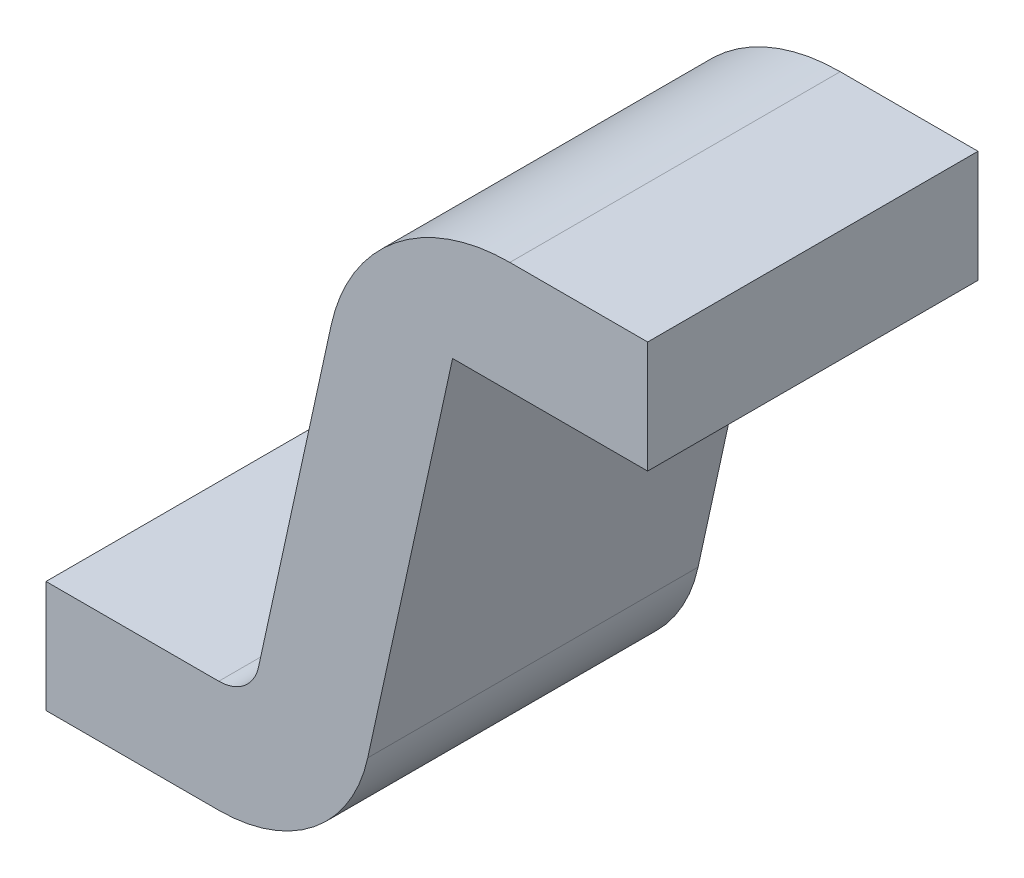
ISO-10303-21;
HEADER;
FILE_DESCRIPTION(('STEP AP214'),'2;1');
FILE_NAME('part.step','',(''),(''),'','','');
FILE_SCHEMA(('AUTOMOTIVE_DESIGN { 1 0 10303 214 1 1 1 1 }'));
ENDSEC;
DATA;
#1=APPLICATION_CONTEXT('core data for automotive mechanical design processes');
#2=APPLICATION_PROTOCOL_DEFINITION('international standard','automotive_design',2000,#1);
#3=PRODUCT_CONTEXT('',#1,'mechanical');
#4=PRODUCT('Part','Part','',(#3));
#5=PRODUCT_RELATED_PRODUCT_CATEGORY('part','',(#4));
#6=PRODUCT_DEFINITION_FORMATION('','',#4);
#7=PRODUCT_DEFINITION_CONTEXT('part definition',#1,'design');
#8=PRODUCT_DEFINITION('design','',#6,#7);
#9=PRODUCT_DEFINITION_SHAPE('','',#8);
#10=(LENGTH_UNIT() NAMED_UNIT(*) SI_UNIT(.MILLI.,.METRE.));
#11=(NAMED_UNIT(*) PLANE_ANGLE_UNIT() SI_UNIT($,.RADIAN.));
#12=(NAMED_UNIT(*) SI_UNIT($,.STERADIAN.) SOLID_ANGLE_UNIT());
#13=UNCERTAINTY_MEASURE_WITH_UNIT(LENGTH_MEASURE(1.E-05),#10,'distance_accuracy_value','');
#14=(GEOMETRIC_REPRESENTATION_CONTEXT(3) GLOBAL_UNCERTAINTY_ASSIGNED_CONTEXT((#13)) GLOBAL_UNIT_ASSIGNED_CONTEXT((#10,
#11,#12)) REPRESENTATION_CONTEXT('',''));
#15=CARTESIAN_POINT('',(0.,0.,0.));
#16=DIRECTION('',(0.,0.,1.));
#17=DIRECTION('',(1.,0.,0.));
#18=AXIS2_PLACEMENT_3D('',#15,#16,#17);
#19=CARTESIAN_POINT('',(0.591933026859,0.5,0.325));
#20=DIRECTION('',(-1.,0.,0.));
#21=DIRECTION('',(0.,0.,1.));
#22=AXIS2_PLACEMENT_3D('',#19,#20,#21);
#23=PLANE('',#22);
#24=DIRECTION('',(0.,0.,1.));
#25=VECTOR('',#24,1.);
#26=CARTESIAN_POINT('',(0.591933026859,0.61,0.325));
#27=LINE('',#26,#25);
#28=CARTESIAN_POINT('',(0.591933026859,0.61,0.));
#29=VERTEX_POINT('',#28);
#30=CARTESIAN_POINT('',(0.591933026859,0.61,0.325));
#31=VERTEX_POINT('',#30);
#32=EDGE_CURVE('E186',#29,#31,#27,.T.);
#33=ORIENTED_EDGE('',*,*,#32,.T.);
#34=DIRECTION('',(0.,1.,0.));
#35=VECTOR('',#34,1.);
#36=CARTESIAN_POINT('',(0.591933026859,0.15,0.325));
#37=LINE('',#36,#35);
#38=CARTESIAN_POINT('',(0.591933026859,0.5,0.325));
#39=VERTEX_POINT('',#38);
#40=EDGE_CURVE('E121',#39,#31,#37,.T.);
#41=ORIENTED_EDGE('',*,*,#40,.F.);
#42=DIRECTION('',(0.,0.,1.));
#43=VECTOR('',#42,1.);
#44=CARTESIAN_POINT('',(0.591933026859,0.5,0.325));
#45=LINE('',#44,#43);
#46=CARTESIAN_POINT('',(0.591933026859,0.5,0.));
#47=VERTEX_POINT('',#46);
#48=EDGE_CURVE('E148',#39,#47,#45,.F.);
#49=ORIENTED_EDGE('',*,*,#48,.T.);
#50=DIRECTION('',(0.,1.,0.));
#51=VECTOR('',#50,1.);
#52=CARTESIAN_POINT('',(0.591933026859,0.15,0.));
#53=LINE('',#52,#51);
#54=EDGE_CURVE('E190',#47,#29,#53,.T.);
#55=ORIENTED_EDGE('',*,*,#54,.T.);
#56=EDGE_LOOP('',(#33,#41,#49,#55));
#57=FACE_BOUND('',#56,.T.);
#58=ADVANCED_FACE('F17',(#57),#23,.F.);
#59=CARTESIAN_POINT('',(0.591933026859,0.61,0.325));
#60=DIRECTION('',(0.,-1.,0.));
#61=DIRECTION('',(1.,0.,0.));
#62=AXIS2_PLACEMENT_3D('',#59,#60,#61);
#63=PLANE('',#62);
#64=DIRECTION('',(0.,0.,-1.));
#65=VECTOR('',#64,1.);
#66=CARTESIAN_POINT('',(0.456358503572,0.61,0.325));
#67=LINE('',#66,#65);
#68=CARTESIAN_POINT('',(0.456358503572,0.61,0.325));
#69=VERTEX_POINT('',#68);
#70=CARTESIAN_POINT('',(0.456358503572,0.61,0.));
#71=VERTEX_POINT('',#70);
#72=EDGE_CURVE('E184',#69,#71,#67,.T.);
#73=ORIENTED_EDGE('',*,*,#72,.F.);
#74=DIRECTION('',(1.,0.,0.));
#75=VECTOR('',#74,1.);
#76=CARTESIAN_POINT('',(0.17,0.61,0.325));
#77=LINE('',#76,#75);
#78=EDGE_CURVE('E122',#31,#69,#77,.F.);
#79=ORIENTED_EDGE('',*,*,#78,.F.);
#80=ORIENTED_EDGE('',*,*,#32,.F.);
#81=DIRECTION('',(1.,0.,0.));
#82=VECTOR('',#81,1.);
#83=CARTESIAN_POINT('',(0.17,0.61,0.));
#84=LINE('',#83,#82);
#85=EDGE_CURVE('E145',#29,#71,#84,.F.);
#86=ORIENTED_EDGE('',*,*,#85,.T.);
#87=EDGE_LOOP('',(#73,#79,#80,#86));
#88=FACE_BOUND('',#87,.T.);
#89=ADVANCED_FACE('F272',(#88),#63,.F.);
#90=CARTESIAN_POINT('',(0.456358503572,0.43,0.325));
#91=DIRECTION('',(0.,0.,-1.));
#92=DIRECTION('',(-1.,0.,0.));
#93=AXIS2_PLACEMENT_3D('',#90,#91,#92);
#94=CYLINDRICAL_SURFACE('',#93,0.18);
#95=CARTESIAN_POINT('',(0.456358503572,0.43,0.325));
#96=DIRECTION('',(0.,0.,-1.));
#97=DIRECTION('',(-1.,0.,0.));
#98=AXIS2_PLACEMENT_3D('',#95,#96,#97);
#99=CIRCLE('',#98,0.18);
#100=CARTESIAN_POINT('',(0.280505991354008,0.468417365171825,0.325));
#101=VERTEX_POINT('',#100);
#102=EDGE_CURVE('E126',#69,#101,#99,.F.);
#103=ORIENTED_EDGE('',*,*,#102,.F.);
#104=ORIENTED_EDGE('',*,*,#72,.T.);
#105=CARTESIAN_POINT('',(0.456358503572,0.43,0.));
#106=DIRECTION('',(0.,0.,-1.));
#107=DIRECTION('',(-1.,0.,0.));
#108=AXIS2_PLACEMENT_3D('',#105,#106,#107);
#109=CIRCLE('',#108,0.18);
#110=CARTESIAN_POINT('',(0.280505991354008,0.468417365171825,0.));
#111=VERTEX_POINT('',#110);
#112=EDGE_CURVE('E142',#71,#111,#109,.F.);
#113=ORIENTED_EDGE('',*,*,#112,.T.);
#114=DIRECTION('',(0.,0.,1.));
#115=VECTOR('',#114,1.);
#116=CARTESIAN_POINT('',(0.280505991354088,0.468417365171981,0.325));
#117=LINE('',#116,#115);
#118=EDGE_CURVE('E182',#111,#101,#117,.T.);
#119=ORIENTED_EDGE('',*,*,#118,.T.);
#120=EDGE_LOOP('',(#103,#104,#113,#119));
#121=FACE_BOUND('',#120,.T.);
#122=ADVANCED_FACE('F269',(#121),#94,.T.);
#123=CARTESIAN_POINT('',(0.209078336048,0.14146280774,0.325));
#124=DIRECTION('',(0.976958401209335,-0.213429806509073,0.));
#125=DIRECTION('',(0.213429806509073,0.976958401209335,0.));
#126=AXIS2_PLACEMENT_3D('',#123,#124,#125);
#127=PLANE('',#126);
#128=DIRECTION('',(0.,0.,-1.));
#129=VECTOR('',#128,1.);
#130=CARTESIAN_POINT('',(0.209078336048432,0.141462807739906,0.325));
#131=LINE('',#130,#129);
#132=CARTESIAN_POINT('',(0.209078336048188,0.141462807739824,0.));
#133=VERTEX_POINT('',#132);
#134=CARTESIAN_POINT('',(0.209078336048188,0.141462807739824,0.325));
#135=VERTEX_POINT('',#134);
#136=EDGE_CURVE('E180',#133,#135,#131,.F.);
#137=ORIENTED_EDGE('',*,*,#136,.T.);
#138=DIRECTION('',(-0.21342980650881,-0.976958401209392,0.));
#139=VECTOR('',#138,1.);
#140=CARTESIAN_POINT('',(0.280505991354,0.468417365172,0.325));
#141=LINE('',#140,#139);
#142=EDGE_CURVE('E150',#101,#135,#141,.T.);
#143=ORIENTED_EDGE('',*,*,#142,.F.);
#144=ORIENTED_EDGE('',*,*,#118,.F.);
#145=DIRECTION('',(-0.21342980650881,-0.976958401209392,0.));
#146=VECTOR('',#145,1.);
#147=CARTESIAN_POINT('',(0.280505991354,0.468417365172,0.));
#148=LINE('',#147,#146);
#149=EDGE_CURVE('E141',#111,#133,#148,.T.);
#150=ORIENTED_EDGE('',*,*,#149,.T.);
#151=EDGE_LOOP('',(#137,#143,#144,#150));
#152=FACE_BOUND('',#151,.T.);
#153=ADVANCED_FACE('F265',(#152),#127,.F.);
#154=CARTESIAN_POINT('',(0.17,0.15,0.325));
#155=DIRECTION('',(0.,0.,-1.));
#156=DIRECTION('',(-1.,0.,0.));
#157=AXIS2_PLACEMENT_3D('',#154,#155,#156);
#158=CYLINDRICAL_SURFACE('',#157,0.04);
#159=DIRECTION('',(0.,0.,-1.));
#160=VECTOR('',#159,1.);
#161=CARTESIAN_POINT('',(0.17,0.11,0.325));
#162=LINE('',#161,#160);
#163=CARTESIAN_POINT('',(0.17,0.11,0.));
#164=VERTEX_POINT('',#163);
#165=CARTESIAN_POINT('',(0.17,0.11,0.325));
#166=VERTEX_POINT('',#165);
#167=EDGE_CURVE('E175',#164,#166,#162,.F.);
#168=ORIENTED_EDGE('',*,*,#167,.T.);
#169=CARTESIAN_POINT('',(0.17,0.15,0.325));
#170=DIRECTION('',(0.,0.,-1.));
#171=DIRECTION('',(-1.,0.,0.));
#172=AXIS2_PLACEMENT_3D('',#169,#170,#171);
#173=CIRCLE('',#172,0.04);
#174=EDGE_CURVE('E149',#135,#166,#173,.T.);
#175=ORIENTED_EDGE('',*,*,#174,.F.);
#176=ORIENTED_EDGE('',*,*,#136,.F.);
#177=CARTESIAN_POINT('',(0.17,0.15,0.));
#178=DIRECTION('',(0.,0.,-1.));
#179=DIRECTION('',(-1.,0.,0.));
#180=AXIS2_PLACEMENT_3D('',#177,#178,#179);
#181=CIRCLE('',#180,0.04);
#182=EDGE_CURVE('E137',#133,#164,#181,.T.);
#183=ORIENTED_EDGE('',*,*,#182,.T.);
#184=EDGE_LOOP('',(#168,#175,#176,#183));
#185=FACE_BOUND('',#184,.T.);
#186=ADVANCED_FACE('F262',(#185),#158,.F.);
#187=CARTESIAN_POINT('',(0.,0.11,0.325));
#188=DIRECTION('',(0.,-1.,0.));
#189=DIRECTION('',(0.,0.,-1.));
#190=AXIS2_PLACEMENT_3D('',#187,#188,#189);
#191=PLANE('',#190);
#192=DIRECTION('',(0.,0.,-1.));
#193=VECTOR('',#192,1.);
#194=CARTESIAN_POINT('',(0.,0.11,0.325));
#195=LINE('',#194,#193);
#196=CARTESIAN_POINT('',(0.,0.11,0.));
#197=VERTEX_POINT('',#196);
#198=CARTESIAN_POINT('',(0.,0.11,0.325));
#199=VERTEX_POINT('',#198);
#200=EDGE_CURVE('E165',#197,#199,#195,.F.);
#201=ORIENTED_EDGE('',*,*,#200,.T.);
#202=DIRECTION('',(1.,0.,0.));
#203=VECTOR('',#202,1.);
#204=CARTESIAN_POINT('',(0.17,0.11,0.325));
#205=LINE('',#204,#203);
#206=EDGE_CURVE('E134',#166,#199,#205,.F.);
#207=ORIENTED_EDGE('',*,*,#206,.F.);
#208=ORIENTED_EDGE('',*,*,#167,.F.);
#209=DIRECTION('',(1.,0.,0.));
#210=VECTOR('',#209,1.);
#211=CARTESIAN_POINT('',(0.17,0.11,0.));
#212=LINE('',#211,#210);
#213=EDGE_CURVE('E140',#164,#197,#212,.F.);
#214=ORIENTED_EDGE('',*,*,#213,.T.);
#215=EDGE_LOOP('',(#201,#207,#208,#214));
#216=FACE_BOUND('',#215,.T.);
#217=ADVANCED_FACE('F212',(#216),#191,.F.);
#218=CARTESIAN_POINT('',(0.,0.,0.325));
#219=DIRECTION('',(1.,0.,0.));
#220=DIRECTION('',(0.,0.,-1.));
#221=AXIS2_PLACEMENT_3D('',#218,#219,#220);
#222=PLANE('',#221);
#223=DIRECTION('',(0.,0.,1.));
#224=VECTOR('',#223,1.);
#225=CARTESIAN_POINT('',(0.,0.,0.325));
#226=LINE('',#225,#224);
#227=CARTESIAN_POINT('',(0.,0.,0.));
#228=VERTEX_POINT('',#227);
#229=CARTESIAN_POINT('',(0.,0.,0.325));
#230=VERTEX_POINT('',#229);
#231=EDGE_CURVE('E116',#228,#230,#226,.T.);
#232=ORIENTED_EDGE('',*,*,#231,.T.);
#233=DIRECTION('',(0.,1.,0.));
#234=VECTOR('',#233,1.);
#235=CARTESIAN_POINT('',(0.,0.15,0.325));
#236=LINE('',#235,#234);
#237=EDGE_CURVE('E105',#199,#230,#236,.F.);
#238=ORIENTED_EDGE('',*,*,#237,.F.);
#239=ORIENTED_EDGE('',*,*,#200,.F.);
#240=DIRECTION('',(0.,1.,0.));
#241=VECTOR('',#240,1.);
#242=CARTESIAN_POINT('',(0.,0.15,0.));
#243=LINE('',#242,#241);
#244=EDGE_CURVE('E168',#197,#228,#243,.F.);
#245=ORIENTED_EDGE('',*,*,#244,.T.);
#246=EDGE_LOOP('',(#232,#238,#239,#245));
#247=FACE_BOUND('',#246,.T.);
#248=ADVANCED_FACE('F216',(#247),#222,.F.);
#249=CARTESIAN_POINT('',(0.,0.,0.325));
#250=DIRECTION('',(0.,1.,0.));
#251=DIRECTION('',(0.,0.,1.));
#252=AXIS2_PLACEMENT_3D('',#249,#250,#251);
#253=PLANE('',#252);
#254=DIRECTION('',(0.,0.,-1.));
#255=VECTOR('',#254,1.);
#256=CARTESIAN_POINT('',(0.17,0.,0.325));
#257=LINE('',#256,#255);
#258=CARTESIAN_POINT('',(0.17,0.,0.325));
#259=VERTEX_POINT('',#258);
#260=CARTESIAN_POINT('',(0.17,0.,0.));
#261=VERTEX_POINT('',#260);
#262=EDGE_CURVE('E107',#259,#261,#257,.T.);
#263=ORIENTED_EDGE('',*,*,#262,.F.);
#264=DIRECTION('',(1.,0.,0.));
#265=VECTOR('',#264,1.);
#266=CARTESIAN_POINT('',(0.17,0.,0.325));
#267=LINE('',#266,#265);
#268=EDGE_CURVE('E98',#230,#259,#267,.T.);
#269=ORIENTED_EDGE('',*,*,#268,.F.);
#270=ORIENTED_EDGE('',*,*,#231,.F.);
#271=DIRECTION('',(1.,0.,0.));
#272=VECTOR('',#271,1.);
#273=CARTESIAN_POINT('',(0.17,0.,0.));
#274=LINE('',#273,#272);
#275=EDGE_CURVE('E112',#228,#261,#274,.T.);
#276=ORIENTED_EDGE('',*,*,#275,.T.);
#277=EDGE_LOOP('',(#263,#269,#270,#276));
#278=FACE_BOUND('',#277,.T.);
#279=ADVANCED_FACE('F110',(#278),#253,.F.);
#280=CARTESIAN_POINT('',(0.17,0.15,0.325));
#281=DIRECTION('',(0.,0.,-1.));
#282=DIRECTION('',(-1.,0.,0.));
#283=AXIS2_PLACEMENT_3D('',#280,#281,#282);
#284=CYLINDRICAL_SURFACE('',#283,0.15);
#285=CARTESIAN_POINT('',(0.17,0.15,0.325));
#286=DIRECTION('',(0.,0.,-1.));
#287=DIRECTION('',(-1.,0.,0.));
#288=AXIS2_PLACEMENT_3D('',#285,#286,#287);
#289=CIRCLE('',#288,0.15);
#290=CARTESIAN_POINT('',(0.316543760180971,0.117985529023869,0.325));
#291=VERTEX_POINT('',#290);
#292=EDGE_CURVE('E20',#259,#291,#289,.F.);
#293=ORIENTED_EDGE('',*,*,#292,.F.);
#294=ORIENTED_EDGE('',*,*,#262,.T.);
#295=CARTESIAN_POINT('',(0.17,0.15,0.));
#296=DIRECTION('',(0.,0.,-1.));
#297=DIRECTION('',(-1.,0.,0.));
#298=AXIS2_PLACEMENT_3D('',#295,#296,#297);
#299=CIRCLE('',#298,0.15);
#300=CARTESIAN_POINT('',(0.316543760180971,0.117985529023869,0.));
#301=VERTEX_POINT('',#300);
#302=EDGE_CURVE('E146',#261,#301,#299,.F.);
#303=ORIENTED_EDGE('',*,*,#302,.T.);
#304=DIRECTION('',(0.,0.,1.));
#305=VECTOR('',#304,1.);
#306=CARTESIAN_POINT('',(0.316543760181,0.117985529024,0.325));
#307=LINE('',#306,#305);
#308=EDGE_CURVE('E120',#301,#291,#307,.T.);
#309=ORIENTED_EDGE('',*,*,#308,.T.);
#310=EDGE_LOOP('',(#293,#294,#303,#309));
#311=FACE_BOUND('',#310,.T.);
#312=ADVANCED_FACE('F119',(#311),#284,.T.);
#313=CARTESIAN_POINT('',(0.17,0.15,0.325));
#314=DIRECTION('',(0.,0.,1.));
#315=DIRECTION('',(1.,0.,0.));
#316=AXIS2_PLACEMENT_3D('',#313,#314,#315);
#317=PLANE('',#316);
#318=ORIENTED_EDGE('',*,*,#206,.T.);
#319=ORIENTED_EDGE('',*,*,#237,.T.);
#320=ORIENTED_EDGE('',*,*,#268,.T.);
#321=ORIENTED_EDGE('',*,*,#292,.T.);
#322=DIRECTION('',(-0.213429806509073,-0.976958401209335,0.));
#323=VECTOR('',#322,1.);
#324=CARTESIAN_POINT('',(0.316543760181,0.117985529024,0.325));
#325=LINE('',#324,#323);
#326=CARTESIAN_POINT('',(0.399999999999571,0.500000000000063,0.325));
#327=VERTEX_POINT('',#326);
#328=EDGE_CURVE('E205',#291,#327,#325,.F.);
#329=ORIENTED_EDGE('',*,*,#328,.T.);
#330=DIRECTION('',(1.,0.,0.));
#331=VECTOR('',#330,1.);
#332=CARTESIAN_POINT('',(0.4,0.5,0.325));
#333=LINE('',#332,#331);
#334=EDGE_CURVE('E133',#327,#39,#333,.T.);
#335=ORIENTED_EDGE('',*,*,#334,.T.);
#336=ORIENTED_EDGE('',*,*,#40,.T.);
#337=ORIENTED_EDGE('',*,*,#78,.T.);
#338=ORIENTED_EDGE('',*,*,#102,.T.);
#339=ORIENTED_EDGE('',*,*,#142,.T.);
#340=ORIENTED_EDGE('',*,*,#174,.T.);
#341=EDGE_LOOP('',(#318,#319,#320,#321,#329,#335,#336,#337,#338,#339,#340));
#342=FACE_BOUND('',#341,.T.);
#343=ADVANCED_FACE('F100',(#342),#317,.T.);
#344=CARTESIAN_POINT('',(0.4,0.5,0.325));
#345=DIRECTION('',(0.,1.,0.));
#346=DIRECTION('',(0.,0.,1.));
#347=AXIS2_PLACEMENT_3D('',#344,#345,#346);
#348=PLANE('',#347);
#349=ORIENTED_EDGE('',*,*,#48,.F.);
#350=ORIENTED_EDGE('',*,*,#334,.F.);
#351=DIRECTION('',(0.,0.,1.));
#352=VECTOR('',#351,1.);
#353=CARTESIAN_POINT('',(0.399999999999571,0.500000000000094,0.325));
#354=LINE('',#353,#352);
#355=CARTESIAN_POINT('',(0.399999999999571,0.500000000000063,0.));
#356=VERTEX_POINT('',#355);
#357=EDGE_CURVE('E26',#327,#356,#354,.F.);
#358=ORIENTED_EDGE('',*,*,#357,.T.);
#359=DIRECTION('',(1.,0.,0.));
#360=VECTOR('',#359,1.);
#361=CARTESIAN_POINT('',(0.17,0.5,0.));
#362=LINE('',#361,#360);
#363=EDGE_CURVE('E34',#356,#47,#362,.T.);
#364=ORIENTED_EDGE('',*,*,#363,.T.);
#365=EDGE_LOOP('',(#349,#350,#358,#364));
#366=FACE_BOUND('',#365,.T.);
#367=ADVANCED_FACE('F239',(#366),#348,.F.);
#368=CARTESIAN_POINT('',(0.17,0.15,0.));
#369=DIRECTION('',(0.,0.,1.));
#370=DIRECTION('',(1.,0.,0.));
#371=AXIS2_PLACEMENT_3D('',#368,#369,#370);
#372=PLANE('',#371);
#373=ORIENTED_EDGE('',*,*,#244,.F.);
#374=ORIENTED_EDGE('',*,*,#213,.F.);
#375=ORIENTED_EDGE('',*,*,#182,.F.);
#376=ORIENTED_EDGE('',*,*,#149,.F.);
#377=ORIENTED_EDGE('',*,*,#112,.F.);
#378=ORIENTED_EDGE('',*,*,#85,.F.);
#379=ORIENTED_EDGE('',*,*,#54,.F.);
#380=ORIENTED_EDGE('',*,*,#363,.F.);
#381=DIRECTION('',(-0.213429806509073,-0.976958401209335,0.));
#382=VECTOR('',#381,1.);
#383=CARTESIAN_POINT('',(0.316543760181,0.117985529024,0.));
#384=LINE('',#383,#382);
#385=EDGE_CURVE('E11',#356,#301,#384,.T.);
#386=ORIENTED_EDGE('',*,*,#385,.T.);
#387=ORIENTED_EDGE('',*,*,#302,.F.);
#388=ORIENTED_EDGE('',*,*,#275,.F.);
#389=EDGE_LOOP('',(#373,#374,#375,#376,#377,#378,#379,#380,#386,#387,#388));
#390=FACE_BOUND('',#389,.T.);
#391=ADVANCED_FACE('F217',(#390),#372,.F.);
#392=CARTESIAN_POINT('',(0.316543760181,0.117985529024,0.325));
#393=DIRECTION('',(-0.976958401209335,0.213429806509073,0.));
#394=DIRECTION('',(-0.213429806509073,-0.976958401209335,0.));
#395=AXIS2_PLACEMENT_3D('',#392,#393,#394);
#396=PLANE('',#395);
#397=ORIENTED_EDGE('',*,*,#357,.F.);
#398=ORIENTED_EDGE('',*,*,#328,.F.);
#399=ORIENTED_EDGE('',*,*,#308,.F.);
#400=ORIENTED_EDGE('',*,*,#385,.F.);
#401=EDGE_LOOP('',(#397,#398,#399,#400));
#402=FACE_BOUND('',#401,.T.);
#403=ADVANCED_FACE('F241',(#402),#396,.F.);
#404=CLOSED_SHELL('',(#58,#89,#122,#153,#186,#217,#248,#279,#312,#343,#367,#391,#403));
#405=MANIFOLD_SOLID_BREP('B1',#404);
#406=ADVANCED_BREP_SHAPE_REPRESENTATION('',(#18,#405),#14);
#407=SHAPE_DEFINITION_REPRESENTATION(#9,#406);
ENDSEC;
END-ISO-10303-21;
